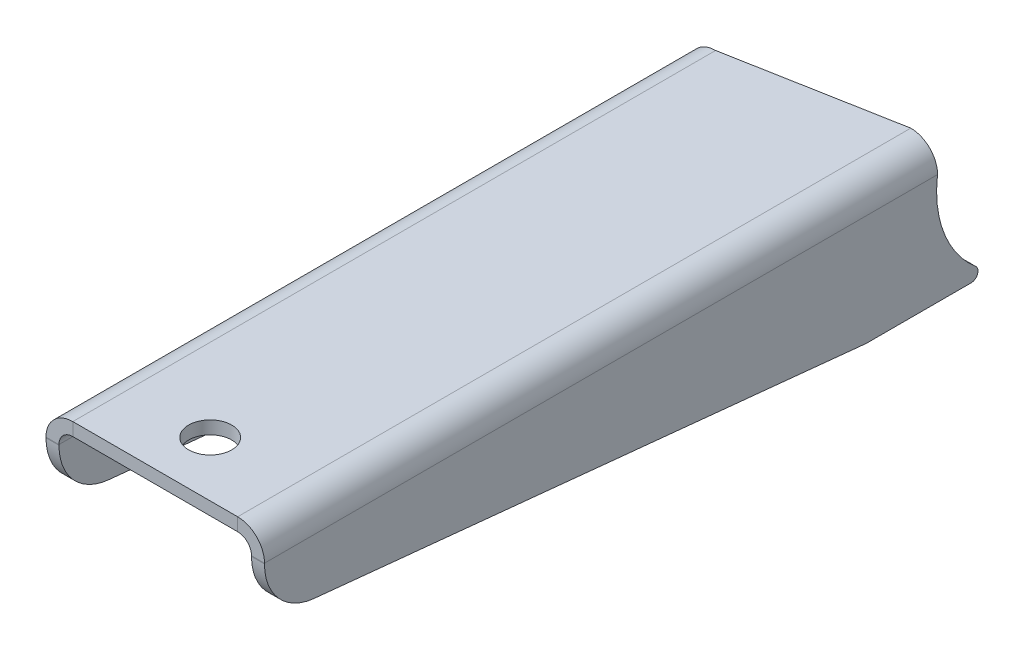
ISO-10303-21;
HEADER;
FILE_DESCRIPTION(('STEP AP214'),'2;1');
FILE_NAME('part.step','',(''),(''),'','','');
FILE_SCHEMA(('AUTOMOTIVE_DESIGN { 1 0 10303 214 1 1 1 1 }'));
ENDSEC;
DATA;
#1=APPLICATION_CONTEXT('core data for automotive mechanical design processes');
#2=APPLICATION_PROTOCOL_DEFINITION('international standard','automotive_design',2000,#1);
#3=PRODUCT_CONTEXT('',#1,'mechanical');
#4=PRODUCT('Part','Part','',(#3));
#5=PRODUCT_RELATED_PRODUCT_CATEGORY('part','',(#4));
#6=PRODUCT_DEFINITION_FORMATION('','',#4);
#7=PRODUCT_DEFINITION_CONTEXT('part definition',#1,'design');
#8=PRODUCT_DEFINITION('design','',#6,#7);
#9=PRODUCT_DEFINITION_SHAPE('','',#8);
#10=(LENGTH_UNIT() NAMED_UNIT(*) SI_UNIT(.MILLI.,.METRE.));
#11=(NAMED_UNIT(*) PLANE_ANGLE_UNIT() SI_UNIT($,.RADIAN.));
#12=(NAMED_UNIT(*) SI_UNIT($,.STERADIAN.) SOLID_ANGLE_UNIT());
#13=UNCERTAINTY_MEASURE_WITH_UNIT(LENGTH_MEASURE(1.E-05),#10,'distance_accuracy_value','');
#14=(GEOMETRIC_REPRESENTATION_CONTEXT(3) GLOBAL_UNCERTAINTY_ASSIGNED_CONTEXT((#13)) GLOBAL_UNIT_ASSIGNED_CONTEXT((#10,
#11,#12)) REPRESENTATION_CONTEXT('',''));
#15=CARTESIAN_POINT('',(0.,0.,0.));
#16=DIRECTION('',(0.,0.,1.));
#17=DIRECTION('',(1.,0.,0.));
#18=AXIS2_PLACEMENT_3D('',#15,#16,#17);
#19=CARTESIAN_POINT('',(-12.6238,-15.875,47.625));
#20=DIRECTION('',(0.,1.,0.));
#21=DIRECTION('',(-1.,0.,0.));
#22=AXIS2_PLACEMENT_3D('',#19,#20,#21);
#23=PLANE('',#22);
#24=DIRECTION('',(0.,0.,1.));
#25=VECTOR('',#24,1.);
#26=CARTESIAN_POINT('',(-12.6238,-15.875,0.));
#27=LINE('',#26,#25);
#28=CARTESIAN_POINT('',(-12.6238,-15.875,-30.603088501944));
#29=VERTEX_POINT('',#28);
#30=CARTESIAN_POINT('',(-12.6238,-15.8750000000011,-22.225));
#31=VERTEX_POINT('',#30);
#32=EDGE_CURVE('E346',#29,#31,#27,.T.);
#33=ORIENTED_EDGE('',*,*,#32,.F.);
#34=DIRECTION('',(-1.,0.,0.));
#35=VECTOR('',#34,1.);
#36=CARTESIAN_POINT('',(-12.6238,-15.875,-30.603088501944));
#37=LINE('',#36,#35);
#38=CARTESIAN_POINT('',(-11.1252,-15.875,-30.603088501944));
#39=VERTEX_POINT('',#38);
#40=EDGE_CURVE('E99',#29,#39,#37,.F.);
#41=ORIENTED_EDGE('',*,*,#40,.T.);
#42=DIRECTION('',(0.,0.,-1.));
#43=VECTOR('',#42,1.);
#44=CARTESIAN_POINT('',(-11.1252,-15.875,47.625));
#45=LINE('',#44,#43);
#46=CARTESIAN_POINT('',(-11.1252,-15.8750000000011,-22.225));
#47=VERTEX_POINT('',#46);
#48=EDGE_CURVE('E345',#39,#47,#45,.F.);
#49=ORIENTED_EDGE('',*,*,#48,.T.);
#50=DIRECTION('',(-1.,0.,0.));
#51=VECTOR('',#50,1.);
#52=CARTESIAN_POINT('',(12.6344008991918,-15.8750000000012,-22.225));
#53=LINE('',#52,#51);
#54=EDGE_CURVE('E266',#47,#31,#53,.T.);
#55=ORIENTED_EDGE('',*,*,#54,.T.);
#56=EDGE_LOOP('',(#33,#41,#49,#55));
#57=FACE_BOUND('',#56,.T.);
#58=ADVANCED_FACE('F91',(#57),#23,.F.);
#59=CARTESIAN_POINT('',(12.6238,-15.875,-47.625));
#60=DIRECTION('',(0.,1.,0.));
#61=DIRECTION('',(-1.,0.,0.));
#62=AXIS2_PLACEMENT_3D('',#59,#60,#61);
#63=PLANE('',#62);
#64=DIRECTION('',(0.,0.,1.));
#65=VECTOR('',#64,1.);
#66=CARTESIAN_POINT('',(11.1252,-15.875,-47.625));
#67=LINE('',#66,#65);
#68=CARTESIAN_POINT('',(11.1252,-15.875,-22.225));
#69=VERTEX_POINT('',#68);
#70=CARTESIAN_POINT('',(11.1252,-15.875,-34.0366078047406));
#71=VERTEX_POINT('',#70);
#72=EDGE_CURVE('E318',#69,#71,#67,.F.);
#73=ORIENTED_EDGE('',*,*,#72,.T.);
#74=DIRECTION('',(1.,0.,0.));
#75=VECTOR('',#74,1.);
#76=CARTESIAN_POINT('',(12.6238,-15.875,-34.0366078047406));
#77=LINE('',#76,#75);
#78=CARTESIAN_POINT('',(12.6238,-15.875,-34.0366078047406));
#79=VERTEX_POINT('',#78);
#80=EDGE_CURVE('E313',#71,#79,#77,.T.);
#81=ORIENTED_EDGE('',*,*,#80,.T.);
#82=DIRECTION('',(0.,0.,-1.));
#83=VECTOR('',#82,1.);
#84=CARTESIAN_POINT('',(12.6238,-15.875,0.));
#85=LINE('',#84,#83);
#86=CARTESIAN_POINT('',(12.6238,-15.8750000000012,-22.225));
#87=VERTEX_POINT('',#86);
#88=EDGE_CURVE('E314',#87,#79,#85,.T.);
#89=ORIENTED_EDGE('',*,*,#88,.F.);
#90=EDGE_CURVE('E265',#87,#69,#53,.T.);
#91=ORIENTED_EDGE('',*,*,#90,.T.);
#92=EDGE_LOOP('',(#73,#81,#89,#91));
#93=FACE_BOUND('',#92,.T.);
#94=ADVANCED_FACE('F613',(#93),#63,.F.);
#95=CARTESIAN_POINT('',(9.525,-1.4986,47.625));
#96=DIRECTION('',(0.,0.,1.));
#97=DIRECTION('',(1.,0.,0.));
#98=AXIS2_PLACEMENT_3D('',#95,#96,#97);
#99=PLANE('',#98);
#100=DIRECTION('',(1.,0.,0.));
#101=VECTOR('',#100,1.);
#102=CARTESIAN_POINT('',(9.525,0.,47.625));
#103=LINE('',#102,#101);
#104=CARTESIAN_POINT('',(-9.525,0.,47.625));
#105=VERTEX_POINT('',#104);
#106=CARTESIAN_POINT('',(9.525,0.,47.625));
#107=VERTEX_POINT('',#106);
#108=EDGE_CURVE('E552',#105,#107,#103,.T.);
#109=ORIENTED_EDGE('',*,*,#108,.F.);
#110=DIRECTION('',(0.,1.,0.));
#111=VECTOR('',#110,1.);
#112=CARTESIAN_POINT('',(-9.525,-1.4986,47.625));
#113=LINE('',#112,#111);
#114=CARTESIAN_POINT('',(-9.525,-1.4986,47.625));
#115=VERTEX_POINT('',#114);
#116=EDGE_CURVE('E334',#115,#105,#113,.T.);
#117=ORIENTED_EDGE('',*,*,#116,.F.);
#118=DIRECTION('',(1.,0.,0.));
#119=VECTOR('',#118,1.);
#120=CARTESIAN_POINT('',(9.525,-1.4986,47.625));
#121=LINE('',#120,#119);
#122=CARTESIAN_POINT('',(9.525,-1.4986,47.625));
#123=VERTEX_POINT('',#122);
#124=EDGE_CURVE('E377',#115,#123,#121,.T.);
#125=ORIENTED_EDGE('',*,*,#124,.T.);
#126=DIRECTION('',(0.,1.,0.));
#127=VECTOR('',#126,1.);
#128=CARTESIAN_POINT('',(9.525,-1.4986,47.625));
#129=LINE('',#128,#127);
#130=EDGE_CURVE('E350',#123,#107,#129,.T.);
#131=ORIENTED_EDGE('',*,*,#130,.T.);
#132=EDGE_LOOP('',(#109,#117,#125,#131));
#133=FACE_BOUND('',#132,.T.);
#134=ADVANCED_FACE('F572',(#133),#99,.T.);
#135=CARTESIAN_POINT('',(0.,-1.4986,0.));
#136=DIRECTION('',(0.,1.,0.));
#137=DIRECTION('',(0.,0.,1.));
#138=AXIS2_PLACEMENT_3D('',#135,#136,#137);
#139=PLANE('',#138);
#140=CARTESIAN_POINT('',(0.,-1.4986,41.275));
#141=DIRECTION('',(0.,1.,0.));
#142=DIRECTION('',(0.,0.,1.));
#143=AXIS2_PLACEMENT_3D('',#140,#141,#142);
#144=CIRCLE('',#143,2.4892);
#145=CARTESIAN_POINT('',(0.,-1.4986,43.7642));
#146=VERTEX_POINT('',#145);
#147=EDGE_CURVE('E347',#146,#146,#144,.T.);
#148=ORIENTED_EDGE('',*,*,#147,.T.);
#149=EDGE_LOOP('',(#148));
#150=FACE_BOUND('',#149,.T.);
#151=DIRECTION('',(0.,0.,1.));
#152=VECTOR('',#151,1.);
#153=CARTESIAN_POINT('',(-9.525,-1.4986,47.625));
#154=LINE('',#153,#152);
#155=CARTESIAN_POINT('',(-9.525,-1.4986,-26.6564528158444));
#156=VERTEX_POINT('',#155);
#157=EDGE_CURVE('E329',#156,#115,#154,.T.);
#158=ORIENTED_EDGE('',*,*,#157,.F.);
#159=DIRECTION('',(0.983495929586019,0.,-0.180930253102496));
#160=VECTOR('',#159,1.);
#161=CARTESIAN_POINT('',(-5.05516838443842,-1.4986,-27.4787518627449));
#162=LINE('',#161,#160);
#163=CARTESIAN_POINT('',(9.52499999999999,-1.4986,-30.1610136563284));
#164=VERTEX_POINT('',#163);
#165=EDGE_CURVE('E298',#156,#164,#162,.T.);
#166=ORIENTED_EDGE('',*,*,#165,.T.);
#167=DIRECTION('',(0.,0.,-1.));
#168=VECTOR('',#167,1.);
#169=CARTESIAN_POINT('',(9.525,-1.4986,47.625));
#170=LINE('',#169,#168);
#171=EDGE_CURVE('E390',#123,#164,#170,.T.);
#172=ORIENTED_EDGE('',*,*,#171,.F.);
#173=ORIENTED_EDGE('',*,*,#124,.F.);
#174=EDGE_LOOP('',(#158,#166,#172,#173));
#175=FACE_BOUND('',#174,.T.);
#176=ADVANCED_FACE('F580',(#150,#175),#139,.F.);
#177=CARTESIAN_POINT('',(0.,0.,0.));
#178=DIRECTION('',(0.,1.,0.));
#179=DIRECTION('',(0.,0.,1.));
#180=AXIS2_PLACEMENT_3D('',#177,#178,#179);
#181=PLANE('',#180);
#182=DIRECTION('',(0.983495929586019,0.,-0.180930253102496));
#183=VECTOR('',#182,1.);
#184=CARTESIAN_POINT('',(-9.525,0.,-26.6564528158444));
#185=LINE('',#184,#183);
#186=CARTESIAN_POINT('',(-9.525,0.,-26.6564528158444));
#187=VERTEX_POINT('',#186);
#188=CARTESIAN_POINT('',(9.52499999999999,0.,-30.1610136563284));
#189=VERTEX_POINT('',#188);
#190=EDGE_CURVE('E287',#187,#189,#185,.T.);
#191=ORIENTED_EDGE('',*,*,#190,.F.);
#192=DIRECTION('',(0.,0.,1.));
#193=VECTOR('',#192,1.);
#194=CARTESIAN_POINT('',(-9.525,0.,47.625));
#195=LINE('',#194,#193);
#196=EDGE_CURVE('E303',#187,#105,#195,.T.);
#197=ORIENTED_EDGE('',*,*,#196,.T.);
#198=ORIENTED_EDGE('',*,*,#108,.T.);
#199=DIRECTION('',(0.,0.,-1.));
#200=VECTOR('',#199,1.);
#201=CARTESIAN_POINT('',(9.525,0.,47.625));
#202=LINE('',#201,#200);
#203=EDGE_CURVE('E393',#107,#189,#202,.T.);
#204=ORIENTED_EDGE('',*,*,#203,.T.);
#205=EDGE_LOOP('',(#191,#197,#198,#204));
#206=FACE_BOUND('',#205,.T.);
#207=CARTESIAN_POINT('',(0.,0.,41.275));
#208=DIRECTION('',(0.,1.,0.));
#209=DIRECTION('',(0.,0.,1.));
#210=AXIS2_PLACEMENT_3D('',#207,#208,#209);
#211=CIRCLE('',#210,2.4892);
#212=CARTESIAN_POINT('',(0.,0.,43.7642));
#213=VERTEX_POINT('',#212);
#214=EDGE_CURVE('E353',#213,#213,#211,.T.);
#215=ORIENTED_EDGE('',*,*,#214,.F.);
#216=EDGE_LOOP('',(#215));
#217=FACE_BOUND('',#216,.T.);
#218=ADVANCED_FACE('F559',(#206,#217),#181,.T.);
#219=CARTESIAN_POINT('',(9.525,-3.0988,47.625));
#220=DIRECTION('',(0.,0.,-1.));
#221=DIRECTION('',(-1.,0.,0.));
#222=AXIS2_PLACEMENT_3D('',#219,#220,#221);
#223=PLANE('',#222);
#224=CARTESIAN_POINT('',(9.525,-3.0988,47.625));
#225=DIRECTION('',(0.,0.,1.));
#226=DIRECTION('',(1.,0.,0.));
#227=AXIS2_PLACEMENT_3D('',#224,#225,#226);
#228=CIRCLE('',#227,1.6002);
#229=CARTESIAN_POINT('',(11.1252,-3.09879999999999,47.625));
#230=VERTEX_POINT('',#229);
#231=EDGE_CURVE('E379',#230,#123,#228,.T.);
#232=ORIENTED_EDGE('',*,*,#231,.F.);
#233=DIRECTION('',(-1.,0.,0.));
#234=VECTOR('',#233,1.);
#235=CARTESIAN_POINT('',(11.1252,-3.09879999999999,47.625));
#236=LINE('',#235,#234);
#237=CARTESIAN_POINT('',(12.6238,-3.09879999999999,47.625));
#238=VERTEX_POINT('',#237);
#239=EDGE_CURVE('E388',#230,#238,#236,.F.);
#240=ORIENTED_EDGE('',*,*,#239,.T.);
#241=CARTESIAN_POINT('',(9.525,-3.0988,47.625));
#242=DIRECTION('',(0.,0.,1.));
#243=DIRECTION('',(1.,0.,0.));
#244=AXIS2_PLACEMENT_3D('',#241,#242,#243);
#245=CIRCLE('',#244,3.0988);
#246=EDGE_CURVE('E384',#238,#107,#245,.T.);
#247=ORIENTED_EDGE('',*,*,#246,.T.);
#248=ORIENTED_EDGE('',*,*,#130,.F.);
#249=EDGE_LOOP('',(#232,#240,#247,#248));
#250=FACE_BOUND('',#249,.T.);
#251=ADVANCED_FACE('F575',(#250),#223,.F.);
#252=CARTESIAN_POINT('',(9.525,-3.0988,47.625));
#253=DIRECTION('',(0.,0.,1.));
#254=DIRECTION('',(1.,0.,0.));
#255=AXIS2_PLACEMENT_3D('',#252,#253,#254);
#256=CYLINDRICAL_SURFACE('',#255,3.0988);
#257=CARTESIAN_POINT('',(12.6238,-3.08197310655706,-30.1610136563284));
#258=CARTESIAN_POINT('',(12.6238,-3.08758158193716,-30.1602639504528));
#259=CARTESIAN_POINT('',(12.6238,-3.09319054806006,-30.1595179989265));
#260=CARTESIAN_POINT('',(12.6238,-3.09879999999436,-30.1587758022435));
#261=B_SPLINE_CURVE_WITH_KNOTS('',3,(#257,#258,#259,#260),.UNSPECIFIED.,.F.,.F.,(4,4),(0.,
0.0100700380749335),.UNSPECIFIED.);
#262=CARTESIAN_POINT('',(12.6237771567679,-3.08197310655706,-30.1610136563284));
#263=VERTEX_POINT('',#262);
#264=CARTESIAN_POINT('',(12.6238,-3.09879999999962,-30.1588959304108));
#265=VERTEX_POINT('',#264);
#266=EDGE_CURVE('E436',#263,#265,#261,.T.);
#267=ORIENTED_EDGE('',*,*,#266,.F.);
#268=CARTESIAN_POINT('',(9.525,-3.0988,-30.1610136563284));
#269=DIRECTION('',(0.,0.,1.));
#270=DIRECTION('',(0.,-1.,0.));
#271=AXIS2_PLACEMENT_3D('',#268,#269,#270);
#272=CIRCLE('',#271,3.0988);
#273=EDGE_CURVE('E438',#189,#263,#272,.F.);
#274=ORIENTED_EDGE('',*,*,#273,.F.);
#275=ORIENTED_EDGE('',*,*,#203,.F.);
#276=ORIENTED_EDGE('',*,*,#246,.F.);
#277=DIRECTION('',(0.,0.,1.));
#278=VECTOR('',#277,1.);
#279=CARTESIAN_POINT('',(12.6238,-3.09879999999999,-47.625));
#280=LINE('',#279,#278);
#281=EDGE_CURVE('E387',#238,#265,#280,.F.);
#282=ORIENTED_EDGE('',*,*,#281,.T.);
#283=EDGE_LOOP('',(#267,#274,#275,#276,#282));
#284=FACE_BOUND('',#283,.T.);
#285=ADVANCED_FACE('F437',(#284),#256,.T.);
#286=CARTESIAN_POINT('',(9.525,-3.0988,47.625));
#287=DIRECTION('',(0.,0.,1.));
#288=DIRECTION('',(1.,0.,0.));
#289=AXIS2_PLACEMENT_3D('',#286,#287,#288);
#290=CYLINDRICAL_SURFACE('',#289,1.6002);
#291=CARTESIAN_POINT('',(9.525,-3.0988,-30.1610136563284));
#292=DIRECTION('',(0.,0.,1.));
#293=DIRECTION('',(0.,-1.,0.));
#294=AXIS2_PLACEMENT_3D('',#291,#292,#293);
#295=CIRCLE('',#294,1.6002);
#296=CARTESIAN_POINT('',(11.1251115260059,-3.08197310655707,-30.1610136563284));
#297=VERTEX_POINT('',#296);
#298=EDGE_CURVE('E506',#164,#297,#295,.F.);
#299=ORIENTED_EDGE('',*,*,#298,.T.);
#300=CARTESIAN_POINT('',(11.1251115260059,-3.08197310655707,-30.1610136563284));
#301=CARTESIAN_POINT('',(11.1251410159303,-3.08477726305029,-30.1606388142027));
#302=CARTESIAN_POINT('',(11.1251631337253,-3.08758158241714,-30.1602649052993));
#303=CARTESIAN_POINT('',(11.1251926250567,-3.09319054689812,-30.1595189539375));
#304=CARTESIAN_POINT('',(11.125199998593,-3.09599519201224,-30.1591469114789));
#305=CARTESIAN_POINT('',(11.1252,-3.0988,-30.1587758022428));
#306=B_SPLINE_CURVE_WITH_KNOTS('',3,(#300,#301,#302,#303,#304,#305),.UNSPECIFIED.,.F.,.F.,(4,2,
4),(0.,0.00848766973824442,0.0169753394764895),.UNSPECIFIED.);
#307=CARTESIAN_POINT('',(11.1252,-3.09879999999474,-30.1587758022435));
#308=VERTEX_POINT('',#307);
#309=EDGE_CURVE('E485',#297,#308,#306,.T.);
#310=ORIENTED_EDGE('',*,*,#309,.T.);
#311=DIRECTION('',(0.,0.,1.));
#312=VECTOR('',#311,1.);
#313=CARTESIAN_POINT('',(11.1252,-3.09879999999999,-47.625));
#314=LINE('',#313,#312);
#315=EDGE_CURVE('E383',#308,#230,#314,.T.);
#316=ORIENTED_EDGE('',*,*,#315,.T.);
#317=ORIENTED_EDGE('',*,*,#231,.T.);
#318=ORIENTED_EDGE('',*,*,#171,.T.);
#319=EDGE_LOOP('',(#299,#310,#316,#317,#318));
#320=FACE_BOUND('',#319,.T.);
#321=ADVANCED_FACE('F538',(#320),#290,.F.);
#322=CARTESIAN_POINT('',(12.6238,-15.875,47.625));
#323=DIRECTION('',(0.,0.,-1.));
#324=DIRECTION('',(-1.,0.,0.));
#325=AXIS2_PLACEMENT_3D('',#322,#323,#324);
#326=PLANE('',#325);
#327=DIRECTION('',(0.,1.,0.));
#328=VECTOR('',#327,1.);
#329=CARTESIAN_POINT('',(11.1252,-15.875,47.625));
#330=LINE('',#329,#328);
#331=CARTESIAN_POINT('',(11.1252,-3.17500000000007,47.625));
#332=VERTEX_POINT('',#331);
#333=EDGE_CURVE('E382',#230,#332,#330,.F.);
#334=ORIENTED_EDGE('',*,*,#333,.T.);
#335=DIRECTION('',(-1.,0.,0.));
#336=VECTOR('',#335,1.);
#337=CARTESIAN_POINT('',(12.6344008991919,-3.17500000000008,47.625));
#338=LINE('',#337,#336);
#339=CARTESIAN_POINT('',(12.6238,-3.17500000000008,47.625));
#340=VERTEX_POINT('',#339);
#341=EDGE_CURVE('E264',#340,#332,#338,.T.);
#342=ORIENTED_EDGE('',*,*,#341,.F.);
#343=DIRECTION('',(0.,-1.,0.));
#344=VECTOR('',#343,1.);
#345=CARTESIAN_POINT('',(12.6238,0.,47.625));
#346=LINE('',#345,#344);
#347=EDGE_CURVE('E319',#238,#340,#346,.T.);
#348=ORIENTED_EDGE('',*,*,#347,.F.);
#349=ORIENTED_EDGE('',*,*,#239,.F.);
#350=EDGE_LOOP('',(#334,#342,#348,#349));
#351=FACE_BOUND('',#350,.T.);
#352=ADVANCED_FACE('F421',(#351),#326,.F.);
#353=CARTESIAN_POINT('',(12.6238,0.,0.));
#354=DIRECTION('',(-1.,0.,0.));
#355=DIRECTION('',(0.,-1.,0.));
#356=AXIS2_PLACEMENT_3D('',#353,#354,#355);
#357=PLANE('',#356);
#358=ORIENTED_EDGE('',*,*,#88,.T.);
#359=CARTESIAN_POINT('',(12.6238,-15.08125,-34.0366078047406));
#360=DIRECTION('',(-1.,0.,0.));
#361=DIRECTION('',(0.,-1.,0.));
#362=AXIS2_PLACEMENT_3D('',#359,#360,#361);
#363=CIRCLE('',#362,0.79375);
#364=CARTESIAN_POINT('',(12.6238,-14.4772433063446,-34.5513045572472));
#365=VERTEX_POINT('',#364);
#366=EDGE_CURVE('E606',#79,#365,#363,.F.);
#367=ORIENTED_EDGE('',*,*,#366,.T.);
#368=CARTESIAN_POINT('',(12.6238,-4.76249999999929,-30.0491786777175));
#369=CARTESIAN_POINT('',(12.6238,-5.90149308988523,-30.0491786777175));
#370=CARTESIAN_POINT('',(12.6238,-7.04039027897428,-30.2035339245496));
#371=CARTESIAN_POINT('',(12.6238,-9.23799149755237,-30.8100974825172));
#372=CARTESIAN_POINT('',(12.6238,-10.2965108855207,-31.2622541026062));
#373=CARTESIAN_POINT('',(12.6238,-12.258659918928,-32.4325243504556));
#374=CARTESIAN_POINT('',(12.6238,-13.1621256084645,-33.1505388345032));
#375=CARTESIAN_POINT('',(12.6238,-14.1355569274067,-34.1625934646591));
#376=CARTESIAN_POINT('',(12.6238,-14.3092542876526,-34.3544598300442));
#377=CARTESIAN_POINT('',(12.6238,-14.4770984481583,-34.551428127676));
#378=B_SPLINE_CURVE_WITH_KNOTS('',3,(#368,#369,#370,#371,#372,#373,#374,#375,#376,#377),
.UNSPECIFIED.,.F.,.F.,(4,2,2,2,4),(0.,0.25,0.5,0.75,0.806435438060686),.UNSPECIFIED.);
#379=CARTESIAN_POINT('',(12.6238,-4.76249999999929,-30.0491786777175));
#380=VERTEX_POINT('',#379);
#381=EDGE_CURVE('E443',#380,#365,#378,.T.);
#382=ORIENTED_EDGE('',*,*,#381,.F.);
#383=CARTESIAN_POINT('',(12.6238,-3.09879999999436,-30.1587758022435));
#384=CARTESIAN_POINT('',(12.6238,-3.37171243112343,-30.1226662672097));
#385=CARTESIAN_POINT('',(12.6238,-3.92547025209057,-30.0676634173557));
#386=CARTESIAN_POINT('',(12.6238,-4.48160427231534,-30.0491786777175));
#387=CARTESIAN_POINT('',(12.6238,-4.76249999999929,-30.0491786777175));
#388=B_SPLINE_CURVE_WITH_KNOTS('',3,(#383,#384,#385,#386,#387),.UNSPECIFIED.,.F.,.F.,(4,1,4),
(0.0100700380749335,0.5,1.),.UNSPECIFIED.);
#389=EDGE_CURVE('E404',#265,#380,#388,.T.);
#390=ORIENTED_EDGE('',*,*,#389,.F.);
#391=ORIENTED_EDGE('',*,*,#281,.F.);
#392=ORIENTED_EDGE('',*,*,#347,.T.);
#393=CARTESIAN_POINT('',(12.6238,-3.17500000000008,41.275));
#394=DIRECTION('',(-1.,0.,0.));
#395=DIRECTION('',(0.,-1.,0.));
#396=AXIS2_PLACEMENT_3D('',#393,#394,#395);
#397=CIRCLE('',#396,6.35);
#398=CARTESIAN_POINT('',(12.6238,-9.4934861578335,41.9068486157835));
#399=VERTEX_POINT('',#398);
#400=EDGE_CURVE('E284',#340,#399,#397,.F.);
#401=ORIENTED_EDGE('',*,*,#400,.T.);
#402=DIRECTION('',(0.,-0.0995037190210164,-0.995037190209987));
#403=VECTOR('',#402,1.);
#404=CARTESIAN_POINT('',(12.6238,-13.5486841776362,1.35486841776386));
#405=LINE('',#404,#403);
#406=CARTESIAN_POINT('',(12.6238,-15.8434861578346,-21.5931513842165));
#407=VERTEX_POINT('',#406);
#408=EDGE_CURVE('E274',#399,#407,#405,.T.);
#409=ORIENTED_EDGE('',*,*,#408,.T.);
#410=CARTESIAN_POINT('',(12.6238,-9.5250000000012,-22.225));
#411=DIRECTION('',(-1.,0.,0.));
#412=DIRECTION('',(0.,-1.,0.));
#413=AXIS2_PLACEMENT_3D('',#410,#411,#412);
#414=CIRCLE('',#413,6.35);
#415=EDGE_CURVE('E279',#407,#87,#414,.F.);
#416=ORIENTED_EDGE('',*,*,#415,.T.);
#417=EDGE_LOOP('',(#358,#367,#382,#390,#391,#392,#401,#409,#416));
#418=FACE_BOUND('',#417,.T.);
#419=ADVANCED_FACE('F410',(#418),#357,.F.);
#420=CARTESIAN_POINT('',(11.1252,0.,0.));
#421=DIRECTION('',(-1.,0.,0.));
#422=DIRECTION('',(0.,-1.,0.));
#423=AXIS2_PLACEMENT_3D('',#420,#421,#422);
#424=PLANE('',#423);
#425=CARTESIAN_POINT('',(11.1252,-4.7624999999993,-30.0491786777175));
#426=CARTESIAN_POINT('',(11.1252,-5.90149308988524,-30.0491786777175));
#427=CARTESIAN_POINT('',(11.1252,-7.04039027897429,-30.2035339245496));
#428=CARTESIAN_POINT('',(11.1252,-9.23799149755237,-30.8100974825172));
#429=CARTESIAN_POINT('',(11.1252,-10.2965108855207,-31.2622541026062));
#430=CARTESIAN_POINT('',(11.1252,-12.258659918928,-32.4325243504556));
#431=CARTESIAN_POINT('',(11.1252,-13.1621256084645,-33.1505388345032));
#432=CARTESIAN_POINT('',(11.1252,-14.7504394880579,-34.8018730218296));
#433=CARTESIAN_POINT('',(11.1252,-15.4351558612932,-35.7350538515715));
#434=CARTESIAN_POINT('',(11.1252,-15.9864235635213,-36.7429851959806));
#435=B_SPLINE_CURVE_WITH_KNOTS('',3,(#425,#426,#427,#428,#429,#430,#431,#432,#433,#434),
.UNSPECIFIED.,.F.,.F.,(4,2,2,2,4),(0.,0.25,0.5,0.75,1.),.UNSPECIFIED.);
#436=CARTESIAN_POINT('',(11.1252,-14.4770985129618,-34.5514282037242));
#437=VERTEX_POINT('',#436);
#438=CARTESIAN_POINT('',(11.1252,-4.7624999999993,-30.0491786777175));
#439=VERTEX_POINT('',#438);
#440=EDGE_CURVE('E524',#437,#439,#435,.F.);
#441=ORIENTED_EDGE('',*,*,#440,.F.);
#442=CARTESIAN_POINT('',(11.1252,-15.08125,-34.0366078047406));
#443=DIRECTION('',(-1.,0.,0.));
#444=DIRECTION('',(0.,-1.,0.));
#445=AXIS2_PLACEMENT_3D('',#442,#443,#444);
#446=CIRCLE('',#445,0.79375);
#447=EDGE_CURVE('E597',#437,#71,#446,.T.);
#448=ORIENTED_EDGE('',*,*,#447,.T.);
#449=ORIENTED_EDGE('',*,*,#72,.F.);
#450=CARTESIAN_POINT('',(11.1252,-9.5250000000012,-22.225));
#451=DIRECTION('',(-1.,0.,0.));
#452=DIRECTION('',(0.,-1.,0.));
#453=AXIS2_PLACEMENT_3D('',#450,#451,#452);
#454=CIRCLE('',#453,6.35);
#455=CARTESIAN_POINT('',(11.1252,-15.8434861578346,-21.5931513842165));
#456=VERTEX_POINT('',#455);
#457=EDGE_CURVE('E277',#456,#69,#454,.F.);
#458=ORIENTED_EDGE('',*,*,#457,.F.);
#459=DIRECTION('',(0.,-0.0995037190210164,-0.995037190209987));
#460=VECTOR('',#459,1.);
#461=CARTESIAN_POINT('',(11.1252,-13.5486841776362,1.35486841776386));
#462=LINE('',#461,#460);
#463=CARTESIAN_POINT('',(11.1252,-9.49348615783349,41.9068486157835));
#464=VERTEX_POINT('',#463);
#465=EDGE_CURVE('E272',#464,#456,#462,.T.);
#466=ORIENTED_EDGE('',*,*,#465,.F.);
#467=CARTESIAN_POINT('',(11.1252,-3.17500000000007,41.275));
#468=DIRECTION('',(-1.,0.,0.));
#469=DIRECTION('',(0.,-1.,0.));
#470=AXIS2_PLACEMENT_3D('',#467,#468,#469);
#471=CIRCLE('',#470,6.35);
#472=EDGE_CURVE('E282',#332,#464,#471,.F.);
#473=ORIENTED_EDGE('',*,*,#472,.F.);
#474=ORIENTED_EDGE('',*,*,#333,.F.);
#475=ORIENTED_EDGE('',*,*,#315,.F.);
#476=CARTESIAN_POINT('',(11.1252,-3.08197310655707,-30.1610136563284));
#477=CARTESIAN_POINT('',(11.1252,-3.36044650151167,-30.1237890763384));
#478=CARTESIAN_POINT('',(11.1252,-3.9198129925128,-30.0678514529129));
#479=CARTESIAN_POINT('',(11.1252,-4.48160427231535,-30.0491786777175));
#480=CARTESIAN_POINT('',(11.1252,-4.7624999999993,-30.0491786777175));
#481=B_SPLINE_CURVE_WITH_KNOTS('',3,(#476,#477,#478,#479,#480),.UNSPECIFIED.,.F.,.F.,(4,1,4),
(0.,0.5,1.),.UNSPECIFIED.);
#482=EDGE_CURVE('E356',#439,#308,#481,.F.);
#483=ORIENTED_EDGE('',*,*,#482,.F.);
#484=EDGE_LOOP('',(#441,#448,#449,#458,#466,#473,#474,#475,#483));
#485=FACE_BOUND('',#484,.T.);
#486=ADVANCED_FACE('F420',(#485),#424,.T.);
#487=CARTESIAN_POINT('',(-9.525,-3.0988,47.625));
#488=DIRECTION('',(0.,0.,1.));
#489=DIRECTION('',(1.,0.,0.));
#490=AXIS2_PLACEMENT_3D('',#487,#488,#489);
#491=PLANE('',#490);
#492=DIRECTION('',(1.,0.,0.));
#493=VECTOR('',#492,1.);
#494=CARTESIAN_POINT('',(-12.6238,-3.09879999999999,47.625));
#495=LINE('',#494,#493);
#496=CARTESIAN_POINT('',(-11.1252,-3.09879999999999,47.625));
#497=VERTEX_POINT('',#496);
#498=CARTESIAN_POINT('',(-12.6238,-3.09879999999999,47.6249999999999));
#499=VERTEX_POINT('',#498);
#500=EDGE_CURVE('E328',#497,#499,#495,.F.);
#501=ORIENTED_EDGE('',*,*,#500,.F.);
#502=CARTESIAN_POINT('',(-9.525,-3.0988,47.625));
#503=DIRECTION('',(0.,0.,-1.));
#504=DIRECTION('',(-1.,0.,0.));
#505=AXIS2_PLACEMENT_3D('',#502,#503,#504);
#506=CIRCLE('',#505,1.6002);
#507=EDGE_CURVE('E325',#115,#497,#506,.F.);
#508=ORIENTED_EDGE('',*,*,#507,.F.);
#509=ORIENTED_EDGE('',*,*,#116,.T.);
#510=CARTESIAN_POINT('',(-9.525,-3.0988,47.6249999999999));
#511=DIRECTION('',(0.,0.,-1.));
#512=DIRECTION('',(-1.,0.,0.));
#513=AXIS2_PLACEMENT_3D('',#510,#511,#512);
#514=CIRCLE('',#513,3.0988);
#515=EDGE_CURVE('E330',#105,#499,#514,.F.);
#516=ORIENTED_EDGE('',*,*,#515,.T.);
#517=EDGE_LOOP('',(#501,#508,#509,#516));
#518=FACE_BOUND('',#517,.T.);
#519=ADVANCED_FACE('F423',(#518),#491,.T.);
#520=CARTESIAN_POINT('',(-9.525,-3.0988,-47.625));
#521=DIRECTION('',(0.,0.,-1.));
#522=DIRECTION('',(-1.,0.,0.));
#523=AXIS2_PLACEMENT_3D('',#520,#521,#522);
#524=CYLINDRICAL_SURFACE('',#523,3.0988);
#525=CARTESIAN_POINT('',(-9.525,-3.0988,-26.6564528158444));
#526=DIRECTION('',(0.,0.,1.));
#527=DIRECTION('',(1.,0.,0.));
#528=AXIS2_PLACEMENT_3D('',#525,#526,#527);
#529=CIRCLE('',#528,3.0988);
#530=CARTESIAN_POINT('',(-12.6238,-3.09879999999999,-26.6564528158444));
#531=VERTEX_POINT('',#530);
#532=EDGE_CURVE('E295',#531,#187,#529,.F.);
#533=ORIENTED_EDGE('',*,*,#532,.F.);
#534=DIRECTION('',(0.,0.,-1.));
#535=VECTOR('',#534,1.);
#536=CARTESIAN_POINT('',(-12.6238,-3.09879999999999,47.625));
#537=LINE('',#536,#535);
#538=EDGE_CURVE('E333',#531,#499,#537,.F.);
#539=ORIENTED_EDGE('',*,*,#538,.T.);
#540=ORIENTED_EDGE('',*,*,#515,.F.);
#541=ORIENTED_EDGE('',*,*,#196,.F.);
#542=EDGE_LOOP('',(#533,#539,#540,#541));
#543=FACE_BOUND('',#542,.T.);
#544=ADVANCED_FACE('F563',(#543),#524,.T.);
#545=CARTESIAN_POINT('',(-9.525,-3.0988,-47.625));
#546=DIRECTION('',(0.,0.,-1.));
#547=DIRECTION('',(-1.,0.,0.));
#548=AXIS2_PLACEMENT_3D('',#545,#546,#547);
#549=CYLINDRICAL_SURFACE('',#548,1.6002);
#550=DIRECTION('',(0.,0.,-1.));
#551=VECTOR('',#550,1.);
#552=CARTESIAN_POINT('',(-11.1252,-3.09879999999999,47.625));
#553=LINE('',#552,#551);
#554=CARTESIAN_POINT('',(-11.1252,-3.09879999999999,-26.6564528158444));
#555=VERTEX_POINT('',#554);
#556=EDGE_CURVE('E338',#497,#555,#553,.T.);
#557=ORIENTED_EDGE('',*,*,#556,.T.);
#558=CARTESIAN_POINT('',(-9.525,-3.0988,-26.6564528158444));
#559=DIRECTION('',(0.,0.,1.));
#560=DIRECTION('',(1.,0.,0.));
#561=AXIS2_PLACEMENT_3D('',#558,#559,#560);
#562=CIRCLE('',#561,1.6002);
#563=EDGE_CURVE('E292',#555,#156,#562,.F.);
#564=ORIENTED_EDGE('',*,*,#563,.T.);
#565=ORIENTED_EDGE('',*,*,#157,.T.);
#566=ORIENTED_EDGE('',*,*,#507,.T.);
#567=EDGE_LOOP('',(#557,#564,#565,#566));
#568=FACE_BOUND('',#567,.T.);
#569=ADVANCED_FACE('F587',(#568),#549,.F.);
#570=CARTESIAN_POINT('',(-12.6238,-1.49859999999999,47.625));
#571=DIRECTION('',(0.,0.,-1.));
#572=DIRECTION('',(-1.,0.,0.));
#573=AXIS2_PLACEMENT_3D('',#570,#571,#572);
#574=PLANE('',#573);
#575=DIRECTION('',(0.,1.,0.));
#576=VECTOR('',#575,1.);
#577=CARTESIAN_POINT('',(-12.6238,0.,47.625));
#578=LINE('',#577,#576);
#579=CARTESIAN_POINT('',(-12.6238,-3.17499999999999,47.625));
#580=VERTEX_POINT('',#579);
#581=EDGE_CURVE('E343',#580,#499,#578,.T.);
#582=ORIENTED_EDGE('',*,*,#581,.F.);
#583=CARTESIAN_POINT('',(-11.1252,-3.175,47.625));
#584=VERTEX_POINT('',#583);
#585=EDGE_CURVE('E255',#584,#580,#338,.T.);
#586=ORIENTED_EDGE('',*,*,#585,.F.);
#587=DIRECTION('',(0.,-1.,0.));
#588=VECTOR('',#587,1.);
#589=CARTESIAN_POINT('',(-11.1252,-1.4986,47.625));
#590=LINE('',#589,#588);
#591=EDGE_CURVE('E337',#584,#497,#590,.F.);
#592=ORIENTED_EDGE('',*,*,#591,.T.);
#593=ORIENTED_EDGE('',*,*,#500,.T.);
#594=EDGE_LOOP('',(#582,#586,#592,#593));
#595=FACE_BOUND('',#594,.T.);
#596=ADVANCED_FACE('F650',(#595),#574,.F.);
#597=CARTESIAN_POINT('',(-12.6238,0.,0.));
#598=DIRECTION('',(1.,0.,0.));
#599=DIRECTION('',(0.,1.,0.));
#600=AXIS2_PLACEMENT_3D('',#597,#598,#599);
#601=PLANE('',#600);
#602=CARTESIAN_POINT('',(-12.6238,-4.76249999999956,-39.3932696531986));
#603=DIRECTION('',(1.,0.,0.));
#604=DIRECTION('',(0.,0.,1.));
#605=AXIS2_PLACEMENT_3D('',#602,#603,#604);
#606=ELLIPSE('',#605,12.8475321387207,12.7);
#607=CARTESIAN_POINT('',(-12.6238,-14.4715355733748,-31.1113083170488));
#608=VERTEX_POINT('',#607);
#609=EDGE_CURVE('E342',#531,#608,#606,.T.);
#610=ORIENTED_EDGE('',*,*,#609,.T.);
#611=CARTESIAN_POINT('',(-12.6238,-15.08125,-30.603088501944));
#612=DIRECTION('',(1.,0.,0.));
#613=DIRECTION('',(0.,1.,0.));
#614=AXIS2_PLACEMENT_3D('',#611,#612,#613);
#615=CIRCLE('',#614,0.79375);
#616=EDGE_CURVE('E113',#608,#29,#615,.F.);
#617=ORIENTED_EDGE('',*,*,#616,.T.);
#618=ORIENTED_EDGE('',*,*,#32,.T.);
#619=CARTESIAN_POINT('',(-12.6238,-9.52500000000112,-22.225));
#620=DIRECTION('',(1.,0.,0.));
#621=DIRECTION('',(0.,1.,0.));
#622=AXIS2_PLACEMENT_3D('',#619,#620,#621);
#623=CIRCLE('',#622,6.35);
#624=CARTESIAN_POINT('',(-12.6238,-15.8434861578345,-21.5931513842165));
#625=VERTEX_POINT('',#624);
#626=EDGE_CURVE('E249',#625,#31,#623,.T.);
#627=ORIENTED_EDGE('',*,*,#626,.F.);
#628=DIRECTION('',(0.,-0.0995037190210164,-0.995037190209987));
#629=VECTOR('',#628,1.);
#630=CARTESIAN_POINT('',(-12.6238,-9.49348615783341,41.9068486157835));
#631=LINE('',#630,#629);
#632=CARTESIAN_POINT('',(-12.6238,-9.49348615783341,41.9068486157835));
#633=VERTEX_POINT('',#632);
#634=EDGE_CURVE('E242',#633,#625,#631,.T.);
#635=ORIENTED_EDGE('',*,*,#634,.F.);
#636=CARTESIAN_POINT('',(-12.6238,-3.17499999999999,41.275));
#637=DIRECTION('',(1.,0.,0.));
#638=DIRECTION('',(0.,1.,0.));
#639=AXIS2_PLACEMENT_3D('',#636,#637,#638);
#640=CIRCLE('',#639,6.35);
#641=EDGE_CURVE('E252',#580,#633,#640,.T.);
#642=ORIENTED_EDGE('',*,*,#641,.F.);
#643=ORIENTED_EDGE('',*,*,#581,.T.);
#644=ORIENTED_EDGE('',*,*,#538,.F.);
#645=EDGE_LOOP('',(#610,#617,#618,#627,#635,#642,#643,#644));
#646=FACE_BOUND('',#645,.T.);
#647=ADVANCED_FACE('F258',(#646),#601,.F.);
#648=CARTESIAN_POINT('',(-11.1252,0.,0.));
#649=DIRECTION('',(1.,0.,0.));
#650=DIRECTION('',(0.,1.,0.));
#651=AXIS2_PLACEMENT_3D('',#648,#649,#650);
#652=PLANE('',#651);
#653=ORIENTED_EDGE('',*,*,#48,.F.);
#654=CARTESIAN_POINT('',(-11.1252,-15.08125,-30.603088501944));
#655=DIRECTION('',(1.,0.,0.));
#656=DIRECTION('',(0.,1.,0.));
#657=AXIS2_PLACEMENT_3D('',#654,#655,#656);
#658=CIRCLE('',#657,0.79375);
#659=CARTESIAN_POINT('',(-11.1252,-14.4715355733748,-31.1113083170488));
#660=VERTEX_POINT('',#659);
#661=EDGE_CURVE('E13',#39,#660,#658,.T.);
#662=ORIENTED_EDGE('',*,*,#661,.T.);
#663=CARTESIAN_POINT('',(-11.1252,-4.76249999999957,-39.3932696531986));
#664=DIRECTION('',(-1.,0.,0.));
#665=DIRECTION('',(0.,0.,1.));
#666=AXIS2_PLACEMENT_3D('',#663,#664,#665);
#667=ELLIPSE('',#666,12.8475321387207,12.7);
#668=EDGE_CURVE('E446',#555,#660,#667,.F.);
#669=ORIENTED_EDGE('',*,*,#668,.F.);
#670=ORIENTED_EDGE('',*,*,#556,.F.);
#671=ORIENTED_EDGE('',*,*,#591,.F.);
#672=CARTESIAN_POINT('',(-11.1252,-3.175,41.275));
#673=DIRECTION('',(1.,0.,0.));
#674=DIRECTION('',(0.,1.,0.));
#675=AXIS2_PLACEMENT_3D('',#672,#673,#674);
#676=CIRCLE('',#675,6.35);
#677=CARTESIAN_POINT('',(-11.1252,-9.49348615783341,41.9068486157835));
#678=VERTEX_POINT('',#677);
#679=EDGE_CURVE('E311',#678,#584,#676,.F.);
#680=ORIENTED_EDGE('',*,*,#679,.F.);
#681=DIRECTION('',(0.,0.0995037190210164,0.995037190209987));
#682=VECTOR('',#681,1.);
#683=CARTESIAN_POINT('',(-11.1252,-13.5486841776361,1.35486841776385));
#684=LINE('',#683,#682);
#685=CARTESIAN_POINT('',(-11.1252,-15.8434861578345,-21.5931513842165));
#686=VERTEX_POINT('',#685);
#687=EDGE_CURVE('E245',#686,#678,#684,.T.);
#688=ORIENTED_EDGE('',*,*,#687,.F.);
#689=CARTESIAN_POINT('',(-11.1252,-9.52500000000112,-22.225));
#690=DIRECTION('',(1.,0.,0.));
#691=DIRECTION('',(0.,1.,0.));
#692=AXIS2_PLACEMENT_3D('',#689,#690,#691);
#693=CIRCLE('',#692,6.35);
#694=EDGE_CURVE('E307',#47,#686,#693,.F.);
#695=ORIENTED_EDGE('',*,*,#694,.F.);
#696=EDGE_LOOP('',(#653,#662,#669,#670,#671,#680,#688,#695));
#697=FACE_BOUND('',#696,.T.);
#698=ADVANCED_FACE('F591',(#697),#652,.T.);
#699=CARTESIAN_POINT('',(0.,-15.875,41.275));
#700=DIRECTION('',(0.,1.,0.));
#701=DIRECTION('',(0.,0.,1.));
#702=AXIS2_PLACEMENT_3D('',#699,#700,#701);
#703=CYLINDRICAL_SURFACE('',#702,2.4892);
#704=ORIENTED_EDGE('',*,*,#214,.T.);
#705=EDGE_LOOP('',(#704));
#706=FACE_BOUND('',#705,.T.);
#707=ORIENTED_EDGE('',*,*,#147,.F.);
#708=EDGE_LOOP('',(#707));
#709=FACE_BOUND('',#708,.T.);
#710=ADVANCED_FACE('F478',(#706,#709),#703,.F.);
#711=CARTESIAN_POINT('',(-12.6238000000001,-3.08197310655715,-30.1610136563284));
#712=CARTESIAN_POINT('',(-12.6238000000001,-3.36044650151175,-30.1237890763384));
#713=CARTESIAN_POINT('',(-12.6238000000001,-3.91981299251288,-30.0678514529129));
#714=CARTESIAN_POINT('',(-12.6238000000001,-4.48160427231543,-30.0491786777175));
#715=CARTESIAN_POINT('',(-12.6238000000001,-4.76249999999938,-30.0491786777175));
#716=B_SPLINE_CURVE_WITH_KNOTS('',3,(#711,#712,#713,#714,#715),.UNSPECIFIED.,.F.,.F.,(4,1,4),
(0.,0.5,1.),.UNSPECIFIED.);
#717=DIRECTION('',(1.,0.,0.));
#718=VECTOR('',#717,1.);
#719=SURFACE_OF_LINEAR_EXTRUSION('',#716,#718);
#720=DIRECTION('',(1.,0.,0.));
#721=VECTOR('',#720,1.);
#722=CARTESIAN_POINT('',(-12.6238000000001,-3.08197310655715,-30.1610136563284));
#723=LINE('',#722,#721);
#724=EDGE_CURVE('E445',#297,#263,#723,.T.);
#725=ORIENTED_EDGE('',*,*,#724,.T.);
#726=ORIENTED_EDGE('',*,*,#266,.T.);
#727=ORIENTED_EDGE('',*,*,#389,.T.);
#728=DIRECTION('',(1.,0.,0.));
#729=VECTOR('',#728,1.);
#730=CARTESIAN_POINT('',(-12.6238000000001,-4.76249999999938,-30.0491786777175));
#731=LINE('',#730,#729);
#732=EDGE_CURVE('E505',#439,#380,#731,.T.);
#733=ORIENTED_EDGE('',*,*,#732,.F.);
#734=ORIENTED_EDGE('',*,*,#482,.T.);
#735=ORIENTED_EDGE('',*,*,#309,.F.);
#736=EDGE_LOOP('',(#725,#726,#727,#733,#734,#735));
#737=FACE_BOUND('',#736,.T.);
#738=ADVANCED_FACE('F472',(#737),#719,.F.);
#739=CARTESIAN_POINT('',(-12.6238000000001,-3.08197310655715,-30.1610136563284));
#740=DIRECTION('',(0.,0.,1.));
#741=DIRECTION('',(0.,-1.,0.));
#742=AXIS2_PLACEMENT_3D('',#739,#740,#741);
#743=PLANE('',#742);
#744=ORIENTED_EDGE('',*,*,#298,.F.);
#745=DIRECTION('',(0.,1.,0.));
#746=VECTOR('',#745,1.);
#747=CARTESIAN_POINT('',(9.52500000000003,-3.08197310655729,-30.1610136563284));
#748=LINE('',#747,#746);
#749=EDGE_CURVE('E308',#164,#189,#748,.T.);
#750=ORIENTED_EDGE('',*,*,#749,.T.);
#751=ORIENTED_EDGE('',*,*,#273,.T.);
#752=ORIENTED_EDGE('',*,*,#724,.F.);
#753=EDGE_LOOP('',(#744,#750,#751,#752));
#754=FACE_BOUND('',#753,.T.);
#755=ADVANCED_FACE('F477',(#754),#743,.F.);
#756=CARTESIAN_POINT('',(-12.6238000000001,-4.76249999999938,-30.0491786777175));
#757=CARTESIAN_POINT('',(-12.6238000000001,-5.90149308988532,-30.0491786777175));
#758=CARTESIAN_POINT('',(-12.6238000000001,-7.04039027897437,-30.2035339245496));
#759=CARTESIAN_POINT('',(-12.6238000000001,-9.23799149755246,-30.8100974825172));
#760=CARTESIAN_POINT('',(-12.6238000000001,-10.2965108855208,-31.2622541026062));
#761=CARTESIAN_POINT('',(-12.6238000000001,-12.2586599189281,-32.4325243504556));
#762=CARTESIAN_POINT('',(-12.6238000000001,-13.1621256084646,-33.1505388345032));
#763=CARTESIAN_POINT('',(-12.6238000000001,-14.750439488058,-34.8018730218296));
#764=CARTESIAN_POINT('',(-12.6238000000001,-15.4351558612933,-35.7350538515715));
#765=CARTESIAN_POINT('',(-12.6238000000001,-15.9864235635214,-36.7429851959806));
#766=B_SPLINE_CURVE_WITH_KNOTS('',3,(#756,#757,#758,#759,#760,#761,#762,#763,#764,#765),
.UNSPECIFIED.,.F.,.F.,(4,2,2,2,4),(0.,0.25,0.5,0.75,1.),.UNSPECIFIED.);
#767=DIRECTION('',(1.,0.,0.));
#768=VECTOR('',#767,1.);
#769=SURFACE_OF_LINEAR_EXTRUSION('',#766,#768);
#770=ORIENTED_EDGE('',*,*,#381,.T.);
#771=DIRECTION('',(1.,0.,0.));
#772=VECTOR('',#771,1.);
#773=CARTESIAN_POINT('',(12.6238,-14.4770985129618,-34.5514282037242));
#774=LINE('',#773,#772);
#775=EDGE_CURVE('E600',#365,#437,#774,.F.);
#776=ORIENTED_EDGE('',*,*,#775,.T.);
#777=ORIENTED_EDGE('',*,*,#440,.T.);
#778=ORIENTED_EDGE('',*,*,#732,.T.);
#779=EDGE_LOOP('',(#770,#776,#777,#778));
#780=FACE_BOUND('',#779,.T.);
#781=ADVANCED_FACE('F479',(#780),#769,.F.);
#782=CARTESIAN_POINT('',(-9.52500000000002,-4.76249999999957,-39.3932696531986));
#783=DIRECTION('',(-1.,0.,0.));
#784=DIRECTION('',(0.,0.,1.));
#785=AXIS2_PLACEMENT_3D('',#782,#783,#784);
#786=ELLIPSE('',#785,12.8475321387207,12.7);
#787=DIRECTION('',(-1.,0.,0.));
#788=VECTOR('',#787,1.);
#789=SURFACE_OF_LINEAR_EXTRUSION('',#786,#788);
#790=ORIENTED_EDGE('',*,*,#668,.T.);
#791=DIRECTION('',(-1.,0.,0.));
#792=VECTOR('',#791,1.);
#793=CARTESIAN_POINT('',(-11.1252,-14.4715355733748,-31.1113083170488));
#794=LINE('',#793,#792);
#795=EDGE_CURVE('E595',#660,#608,#794,.T.);
#796=ORIENTED_EDGE('',*,*,#795,.T.);
#797=ORIENTED_EDGE('',*,*,#609,.F.);
#798=DIRECTION('',(-1.,0.,0.));
#799=VECTOR('',#798,1.);
#800=CARTESIAN_POINT('',(-9.52500000000001,-3.0988,-26.6564528158444));
#801=LINE('',#800,#799);
#802=EDGE_CURVE('E450',#555,#531,#801,.T.);
#803=ORIENTED_EDGE('',*,*,#802,.F.);
#804=EDGE_LOOP('',(#790,#796,#797,#803));
#805=FACE_BOUND('',#804,.T.);
#806=ADVANCED_FACE('F633',(#805),#789,.F.);
#807=CARTESIAN_POINT('',(-9.525,-3.09879999999999,-26.6564528158444));
#808=DIRECTION('',(0.180930253102496,0.,0.983495929586019));
#809=DIRECTION('',(0.983495929586019,0.,-0.180930253102496));
#810=AXIS2_PLACEMENT_3D('',#807,#808,#809);
#811=PLANE('',#810);
#812=DIRECTION('',(0.,1.,0.));
#813=VECTOR('',#812,1.);
#814=CARTESIAN_POINT('',(-9.525,-3.09879999999999,-26.6564528158444));
#815=LINE('',#814,#813);
#816=EDGE_CURVE('E289',#156,#187,#815,.T.);
#817=ORIENTED_EDGE('',*,*,#816,.T.);
#818=ORIENTED_EDGE('',*,*,#190,.T.);
#819=ORIENTED_EDGE('',*,*,#749,.F.);
#820=ORIENTED_EDGE('',*,*,#165,.F.);
#821=EDGE_LOOP('',(#817,#818,#819,#820));
#822=FACE_BOUND('',#821,.T.);
#823=ADVANCED_FACE('F583',(#822),#811,.F.);
#824=CARTESIAN_POINT('',(-11.1252,-3.09879999999999,-26.6564528158444));
#825=DIRECTION('',(0.,0.,1.));
#826=DIRECTION('',(1.,0.,0.));
#827=AXIS2_PLACEMENT_3D('',#824,#825,#826);
#828=PLANE('',#827);
#829=ORIENTED_EDGE('',*,*,#532,.T.);
#830=ORIENTED_EDGE('',*,*,#816,.F.);
#831=ORIENTED_EDGE('',*,*,#563,.F.);
#832=ORIENTED_EDGE('',*,*,#802,.T.);
#833=EDGE_LOOP('',(#829,#830,#831,#832));
#834=FACE_BOUND('',#833,.T.);
#835=ADVANCED_FACE('F585',(#834),#828,.F.);
#836=CARTESIAN_POINT('',(12.6344008991919,-9.4934861578335,41.9068486157835));
#837=DIRECTION('',(0.,0.995037190209987,-0.0995037190210164));
#838=DIRECTION('',(0.,0.0995037190210164,0.995037190209987));
#839=AXIS2_PLACEMENT_3D('',#836,#837,#838);
#840=PLANE('',#839);
#841=ORIENTED_EDGE('',*,*,#687,.T.);
#842=DIRECTION('',(-1.,0.,0.));
#843=VECTOR('',#842,1.);
#844=CARTESIAN_POINT('',(12.6344008991919,-9.4934861578335,41.9068486157835));
#845=LINE('',#844,#843);
#846=EDGE_CURVE('E238',#678,#633,#845,.T.);
#847=ORIENTED_EDGE('',*,*,#846,.T.);
#848=ORIENTED_EDGE('',*,*,#634,.T.);
#849=DIRECTION('',(-1.,0.,0.));
#850=VECTOR('',#849,1.);
#851=CARTESIAN_POINT('',(12.6344008991918,-15.8434861578346,-21.5931513842165));
#852=LINE('',#851,#850);
#853=EDGE_CURVE('E270',#686,#625,#852,.T.);
#854=ORIENTED_EDGE('',*,*,#853,.F.);
#855=EDGE_LOOP('',(#841,#847,#848,#854));
#856=FACE_BOUND('',#855,.T.);
#857=ADVANCED_FACE('F240',(#856),#840,.F.);
#858=CARTESIAN_POINT('',(12.6344008991919,-9.5250000000012,-22.225));
#859=DIRECTION('',(-1.,0.,0.));
#860=DIRECTION('',(0.,-1.,0.));
#861=AXIS2_PLACEMENT_3D('',#858,#859,#860);
#862=CYLINDRICAL_SURFACE('',#861,6.35);
#863=ORIENTED_EDGE('',*,*,#694,.T.);
#864=ORIENTED_EDGE('',*,*,#853,.T.);
#865=ORIENTED_EDGE('',*,*,#626,.T.);
#866=ORIENTED_EDGE('',*,*,#54,.F.);
#867=EDGE_LOOP('',(#863,#864,#865,#866));
#868=FACE_BOUND('',#867,.T.);
#869=ADVANCED_FACE('F661',(#868),#862,.T.);
#870=CARTESIAN_POINT('',(12.6344008991919,-3.17500000000008,41.275));
#871=DIRECTION('',(-1.,0.,0.));
#872=DIRECTION('',(0.,-1.,0.));
#873=AXIS2_PLACEMENT_3D('',#870,#871,#872);
#874=CYLINDRICAL_SURFACE('',#873,6.35);
#875=ORIENTED_EDGE('',*,*,#679,.T.);
#876=ORIENTED_EDGE('',*,*,#585,.T.);
#877=ORIENTED_EDGE('',*,*,#641,.T.);
#878=ORIENTED_EDGE('',*,*,#846,.F.);
#879=EDGE_LOOP('',(#875,#876,#877,#878));
#880=FACE_BOUND('',#879,.T.);
#881=ADVANCED_FACE('F253',(#880),#874,.T.);
#882=ORIENTED_EDGE('',*,*,#341,.T.);
#883=ORIENTED_EDGE('',*,*,#472,.T.);
#884=EDGE_CURVE('E248',#399,#464,#845,.T.);
#885=ORIENTED_EDGE('',*,*,#884,.F.);
#886=ORIENTED_EDGE('',*,*,#400,.F.);
#887=EDGE_LOOP('',(#882,#883,#885,#886));
#888=FACE_BOUND('',#887,.T.);
#889=ADVANCED_FACE('F659',(#888),#874,.T.);
#890=EDGE_CURVE('E269',#407,#456,#852,.T.);
#891=ORIENTED_EDGE('',*,*,#890,.T.);
#892=ORIENTED_EDGE('',*,*,#457,.T.);
#893=ORIENTED_EDGE('',*,*,#90,.F.);
#894=ORIENTED_EDGE('',*,*,#415,.F.);
#895=EDGE_LOOP('',(#891,#892,#893,#894));
#896=FACE_BOUND('',#895,.T.);
#897=ADVANCED_FACE('F621',(#896),#862,.T.);
#898=ORIENTED_EDGE('',*,*,#884,.T.);
#899=ORIENTED_EDGE('',*,*,#465,.T.);
#900=ORIENTED_EDGE('',*,*,#890,.F.);
#901=ORIENTED_EDGE('',*,*,#408,.F.);
#902=EDGE_LOOP('',(#898,#899,#900,#901));
#903=FACE_BOUND('',#902,.T.);
#904=ADVANCED_FACE('F625',(#903),#840,.F.);
#905=CARTESIAN_POINT('',(11.8745,-15.08125,-34.0366078047406));
#906=DIRECTION('',(1.,0.,0.));
#907=DIRECTION('',(0.,1.,0.));
#908=AXIS2_PLACEMENT_3D('',#905,#906,#907);
#909=CYLINDRICAL_SURFACE('',#908,0.79375);
#910=ORIENTED_EDGE('',*,*,#447,.F.);
#911=ORIENTED_EDGE('',*,*,#775,.F.);
#912=ORIENTED_EDGE('',*,*,#366,.F.);
#913=ORIENTED_EDGE('',*,*,#80,.F.);
#914=EDGE_LOOP('',(#910,#911,#912,#913));
#915=FACE_BOUND('',#914,.T.);
#916=ADVANCED_FACE('F631',(#915),#909,.T.);
#917=CARTESIAN_POINT('',(-11.8745,-15.08125,-30.603088501944));
#918=DIRECTION('',(-1.,0.,0.));
#919=DIRECTION('',(0.,-1.,0.));
#920=AXIS2_PLACEMENT_3D('',#917,#918,#919);
#921=CYLINDRICAL_SURFACE('',#920,0.79375);
#922=ORIENTED_EDGE('',*,*,#661,.F.);
#923=ORIENTED_EDGE('',*,*,#40,.F.);
#924=ORIENTED_EDGE('',*,*,#616,.F.);
#925=ORIENTED_EDGE('',*,*,#795,.F.);
#926=EDGE_LOOP('',(#922,#923,#924,#925));
#927=FACE_BOUND('',#926,.T.);
#928=ADVANCED_FACE('F93',(#927),#921,.T.);
#929=CLOSED_SHELL('',(#58,#94,#134,#176,#218,#251,#285,#321,#352,#419,#486,#519,#544,#569,#596,
#647,#698,#710,#738,#755,#781,#806,#823,#835,#857,#869,#881,#889,#897,#904,#916,#928));
#930=MANIFOLD_SOLID_BREP('B2',#929);
#931=ADVANCED_BREP_SHAPE_REPRESENTATION('',(#18,#930),#14);
#932=SHAPE_DEFINITION_REPRESENTATION(#9,#931);
ENDSEC;
END-ISO-10303-21;
